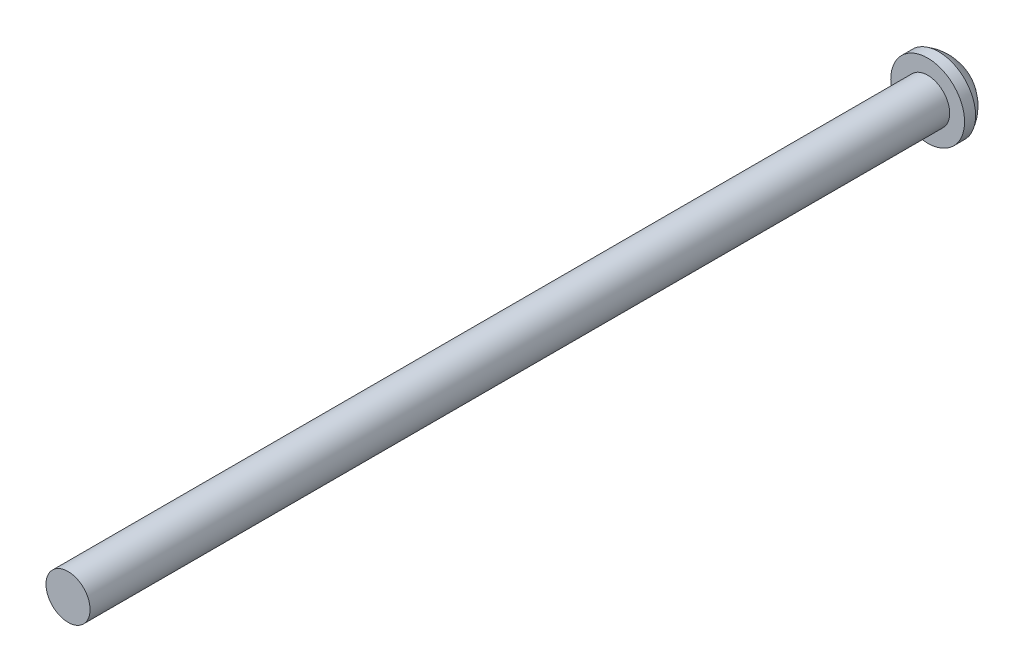
ISO-10303-21;
HEADER;
FILE_DESCRIPTION(('STEP AP214'),'2;1');
FILE_NAME('part.step','',(''),(''),'','','');
FILE_SCHEMA(('AUTOMOTIVE_DESIGN { 1 0 10303 214 1 1 1 1 }'));
ENDSEC;
DATA;
#1=APPLICATION_CONTEXT('core data for automotive mechanical design processes');
#2=APPLICATION_PROTOCOL_DEFINITION('international standard','automotive_design',2000,#1);
#3=PRODUCT_CONTEXT('',#1,'mechanical');
#4=PRODUCT('Part','Part','',(#3));
#5=PRODUCT_RELATED_PRODUCT_CATEGORY('part','',(#4));
#6=PRODUCT_DEFINITION_FORMATION('','',#4);
#7=PRODUCT_DEFINITION_CONTEXT('part definition',#1,'design');
#8=PRODUCT_DEFINITION('design','',#6,#7);
#9=PRODUCT_DEFINITION_SHAPE('','',#8);
#10=(LENGTH_UNIT() NAMED_UNIT(*) SI_UNIT(.MILLI.,.METRE.));
#11=(NAMED_UNIT(*) PLANE_ANGLE_UNIT() SI_UNIT($,.RADIAN.));
#12=(NAMED_UNIT(*) SI_UNIT($,.STERADIAN.) SOLID_ANGLE_UNIT());
#13=UNCERTAINTY_MEASURE_WITH_UNIT(LENGTH_MEASURE(1.E-05),#10,'distance_accuracy_value','');
#14=(GEOMETRIC_REPRESENTATION_CONTEXT(3) GLOBAL_UNCERTAINTY_ASSIGNED_CONTEXT((#13)) GLOBAL_UNIT_ASSIGNED_CONTEXT((#10,
#11,#12)) REPRESENTATION_CONTEXT('',''));
#15=CARTESIAN_POINT('',(0.,0.,0.));
#16=DIRECTION('',(0.,0.,1.));
#17=DIRECTION('',(1.,0.,0.));
#18=AXIS2_PLACEMENT_3D('',#15,#16,#17);
#19=CARTESIAN_POINT('',(0.,0.,78.));
#20=DIRECTION('',(0.,0.,-1.));
#21=DIRECTION('',(-1.,0.,0.));
#22=AXIS2_PLACEMENT_3D('',#19,#20,#21);
#23=CYLINDRICAL_SURFACE('',#22,2.);
#24=CARTESIAN_POINT('',(0.,0.,78.));
#25=DIRECTION('',(0.,0.,1.));
#26=DIRECTION('',(1.,0.,0.));
#27=AXIS2_PLACEMENT_3D('',#24,#25,#26);
#28=CIRCLE('',#27,2.);
#29=CARTESIAN_POINT('',(2.,0.,78.));
#30=VERTEX_POINT('',#29);
#31=EDGE_CURVE('E10',#30,#30,#28,.T.);
#32=ORIENTED_EDGE('',*,*,#31,.F.);
#33=EDGE_LOOP('',(#32));
#34=FACE_BOUND('',#33,.T.);
#35=CARTESIAN_POINT('',(0.,0.,0.));
#36=DIRECTION('',(0.,0.,-1.));
#37=DIRECTION('',(-1.,0.,0.));
#38=AXIS2_PLACEMENT_3D('',#35,#36,#37);
#39=CIRCLE('',#38,2.);
#40=CARTESIAN_POINT('',(-2.,0.,0.));
#41=VERTEX_POINT('',#40);
#42=EDGE_CURVE('E45',#41,#41,#39,.T.);
#43=ORIENTED_EDGE('',*,*,#42,.F.);
#44=EDGE_LOOP('',(#43));
#45=FACE_BOUND('',#44,.T.);
#46=ADVANCED_FACE('F37',(#34,#45),#23,.T.);
#47=CARTESIAN_POINT('',(0.,0.,78.));
#48=DIRECTION('',(0.,0.,1.));
#49=DIRECTION('',(1.,0.,0.));
#50=AXIS2_PLACEMENT_3D('',#47,#48,#49);
#51=PLANE('',#50);
#52=ORIENTED_EDGE('',*,*,#31,.T.);
#53=EDGE_LOOP('',(#52));
#54=FACE_BOUND('',#53,.T.);
#55=ADVANCED_FACE('F67',(#54),#51,.T.);
#56=CARTESIAN_POINT('',(0.,0.,0.));
#57=DIRECTION('',(0.,0.,-1.));
#58=DIRECTION('',(-1.,0.,0.));
#59=AXIS2_PLACEMENT_3D('',#56,#57,#58);
#60=PLANE('',#59);
#61=CARTESIAN_POINT('',(0.,0.,0.));
#62=DIRECTION('',(0.,0.,-1.));
#63=DIRECTION('',(-1.,0.,0.));
#64=AXIS2_PLACEMENT_3D('',#61,#62,#63);
#65=CIRCLE('',#64,3.35);
#66=CARTESIAN_POINT('',(-3.35,0.,0.));
#67=VERTEX_POINT('',#66);
#68=EDGE_CURVE('E51',#67,#67,#65,.T.);
#69=ORIENTED_EDGE('',*,*,#68,.F.);
#70=EDGE_LOOP('',(#69));
#71=FACE_BOUND('',#70,.T.);
#72=ORIENTED_EDGE('',*,*,#42,.T.);
#73=EDGE_LOOP('',(#72));
#74=FACE_BOUND('',#73,.T.);
#75=ADVANCED_FACE('F61',(#71,#74),#60,.F.);
#76=CARTESIAN_POINT('',(0.,0.,-1.));
#77=DIRECTION('',(0.,0.,1.));
#78=DIRECTION('',(1.,0.,0.));
#79=AXIS2_PLACEMENT_3D('',#76,#77,#78);
#80=CYLINDRICAL_SURFACE('',#79,3.35);
#81=CARTESIAN_POINT('',(0.,0.,-1.));
#82=DIRECTION('',(0.,0.,-1.));
#83=DIRECTION('',(-1.,0.,0.));
#84=AXIS2_PLACEMENT_3D('',#81,#82,#83);
#85=CIRCLE('',#84,3.35);
#86=CARTESIAN_POINT('',(-3.35,0.,-1.));
#87=VERTEX_POINT('',#86);
#88=EDGE_CURVE('E41',#87,#87,#85,.T.);
#89=ORIENTED_EDGE('',*,*,#88,.F.);
#90=EDGE_LOOP('',(#89));
#91=FACE_BOUND('',#90,.T.);
#92=ORIENTED_EDGE('',*,*,#68,.T.);
#93=EDGE_LOOP('',(#92));
#94=FACE_BOUND('',#93,.T.);
#95=ADVANCED_FACE('F59',(#91,#94),#80,.T.);
#96=CARTESIAN_POINT('',(0.,0.,0.805625));
#97=DIRECTION('',(0.,0.,1.));
#98=DIRECTION('',(1.,0.,0.));
#99=AXIS2_PLACEMENT_3D('',#96,#97,#98);
#100=SPHERICAL_SURFACE('',#99,3.805625);
#101=ORIENTED_EDGE('',*,*,#88,.T.);
#102=EDGE_LOOP('',(#101));
#103=FACE_BOUND('',#102,.T.);
#104=ADVANCED_FACE('F39',(#103),#100,.T.);
#105=CLOSED_SHELL('',(#46,#55,#75,#95,#104));
#106=MANIFOLD_SOLID_BREP('B2',#105);
#107=ADVANCED_BREP_SHAPE_REPRESENTATION('',(#18,#106),#14);
#108=SHAPE_DEFINITION_REPRESENTATION(#9,#107);
ENDSEC;
END-ISO-10303-21;
